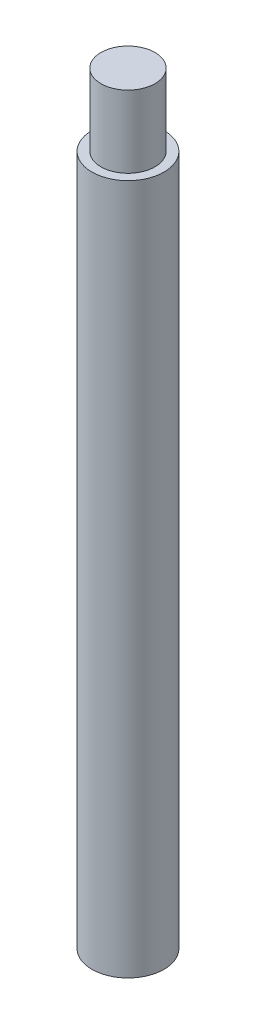
ISO-10303-21;
HEADER;
FILE_DESCRIPTION(('STEP AP214'),'2;1');
FILE_NAME('part.step','',(''),(''),'','','');
FILE_SCHEMA(('AUTOMOTIVE_DESIGN { 1 0 10303 214 1 1 1 1 }'));
ENDSEC;
DATA;
#1=APPLICATION_CONTEXT('core data for automotive mechanical design processes');
#2=APPLICATION_PROTOCOL_DEFINITION('international standard','automotive_design',2000,#1);
#3=PRODUCT_CONTEXT('',#1,'mechanical');
#4=PRODUCT('Part','Part','',(#3));
#5=PRODUCT_RELATED_PRODUCT_CATEGORY('part','',(#4));
#6=PRODUCT_DEFINITION_FORMATION('','',#4);
#7=PRODUCT_DEFINITION_CONTEXT('part definition',#1,'design');
#8=PRODUCT_DEFINITION('design','',#6,#7);
#9=PRODUCT_DEFINITION_SHAPE('','',#8);
#10=(LENGTH_UNIT() NAMED_UNIT(*) SI_UNIT(.MILLI.,.METRE.));
#11=(NAMED_UNIT(*) PLANE_ANGLE_UNIT() SI_UNIT($,.RADIAN.));
#12=(NAMED_UNIT(*) SI_UNIT($,.STERADIAN.) SOLID_ANGLE_UNIT());
#13=UNCERTAINTY_MEASURE_WITH_UNIT(LENGTH_MEASURE(1.E-05),#10,'distance_accuracy_value','');
#14=(GEOMETRIC_REPRESENTATION_CONTEXT(3) GLOBAL_UNCERTAINTY_ASSIGNED_CONTEXT((#13)) GLOBAL_UNIT_ASSIGNED_CONTEXT((#10,
#11,#12)) REPRESENTATION_CONTEXT('',''));
#15=CARTESIAN_POINT('',(0.,0.,0.));
#16=DIRECTION('',(0.,0.,1.));
#17=DIRECTION('',(1.,0.,0.));
#18=AXIS2_PLACEMENT_3D('',#15,#16,#17);
#19=CARTESIAN_POINT('',(0.,57.5,0.));
#20=DIRECTION('',(0.,-1.,0.));
#21=DIRECTION('',(0.,0.,-1.));
#22=AXIS2_PLACEMENT_3D('',#19,#20,#21);
#23=CYLINDRICAL_SURFACE('',#22,3.);
#24=CARTESIAN_POINT('',(0.,57.5,0.));
#25=DIRECTION('',(0.,1.,0.));
#26=DIRECTION('',(0.,0.,1.));
#27=AXIS2_PLACEMENT_3D('',#24,#25,#26);
#28=CIRCLE('',#27,3.);
#29=CARTESIAN_POINT('',(0.,57.5,3.));
#30=VERTEX_POINT('',#29);
#31=EDGE_CURVE('E51',#30,#30,#28,.T.);
#32=ORIENTED_EDGE('',*,*,#31,.F.);
#33=EDGE_LOOP('',(#32));
#34=FACE_BOUND('',#33,.T.);
#35=CARTESIAN_POINT('',(0.,0.,0.));
#36=DIRECTION('',(0.,1.,0.));
#37=DIRECTION('',(0.,0.,1.));
#38=AXIS2_PLACEMENT_3D('',#35,#36,#37);
#39=CIRCLE('',#38,3.);
#40=CARTESIAN_POINT('',(0.,0.,3.));
#41=VERTEX_POINT('',#40);
#42=EDGE_CURVE('E46',#41,#41,#39,.T.);
#43=ORIENTED_EDGE('',*,*,#42,.T.);
#44=EDGE_LOOP('',(#43));
#45=FACE_BOUND('',#44,.T.);
#46=ADVANCED_FACE('F43',(#34,#45),#23,.T.);
#47=CARTESIAN_POINT('',(0.,57.5,0.));
#48=DIRECTION('',(0.,1.,0.));
#49=DIRECTION('',(0.,0.,1.));
#50=AXIS2_PLACEMENT_3D('',#47,#48,#49);
#51=PLANE('',#50);
#52=CARTESIAN_POINT('',(0.,57.5,0.));
#53=DIRECTION('',(0.,1.,0.));
#54=DIRECTION('',(0.,0.,1.));
#55=AXIS2_PLACEMENT_3D('',#52,#53,#54);
#56=CIRCLE('',#55,2.25);
#57=CARTESIAN_POINT('',(0.,57.5,2.25));
#58=VERTEX_POINT('',#57);
#59=EDGE_CURVE('E10',#58,#58,#56,.T.);
#60=ORIENTED_EDGE('',*,*,#59,.F.);
#61=EDGE_LOOP('',(#60));
#62=FACE_BOUND('',#61,.T.);
#63=ORIENTED_EDGE('',*,*,#31,.T.);
#64=EDGE_LOOP('',(#63));
#65=FACE_BOUND('',#64,.T.);
#66=ADVANCED_FACE('F71',(#62,#65),#51,.T.);
#67=CARTESIAN_POINT('',(0.,0.,0.));
#68=DIRECTION('',(0.,1.,0.));
#69=DIRECTION('',(0.,0.,1.));
#70=AXIS2_PLACEMENT_3D('',#67,#68,#69);
#71=PLANE('',#70);
#72=ORIENTED_EDGE('',*,*,#42,.F.);
#73=EDGE_LOOP('',(#72));
#74=FACE_BOUND('',#73,.T.);
#75=ADVANCED_FACE('F68',(#74),#71,.F.);
#76=CARTESIAN_POINT('',(0.,63.5,0.));
#77=DIRECTION('',(0.,-1.,0.));
#78=DIRECTION('',(0.,0.,-1.));
#79=AXIS2_PLACEMENT_3D('',#76,#77,#78);
#80=CYLINDRICAL_SURFACE('',#79,2.25);
#81=CARTESIAN_POINT('',(0.,63.5,0.));
#82=DIRECTION('',(0.,1.,0.));
#83=DIRECTION('',(0.,0.,1.));
#84=AXIS2_PLACEMENT_3D('',#81,#82,#83);
#85=CIRCLE('',#84,2.25);
#86=CARTESIAN_POINT('',(0.,63.5,2.25));
#87=VERTEX_POINT('',#86);
#88=EDGE_CURVE('E58',#87,#87,#85,.T.);
#89=ORIENTED_EDGE('',*,*,#88,.F.);
#90=EDGE_LOOP('',(#89));
#91=FACE_BOUND('',#90,.T.);
#92=ORIENTED_EDGE('',*,*,#59,.T.);
#93=EDGE_LOOP('',(#92));
#94=FACE_BOUND('',#93,.T.);
#95=ADVANCED_FACE('F70',(#91,#94),#80,.T.);
#96=CARTESIAN_POINT('',(0.,63.5,0.));
#97=DIRECTION('',(0.,1.,0.));
#98=DIRECTION('',(0.,0.,1.));
#99=AXIS2_PLACEMENT_3D('',#96,#97,#98);
#100=PLANE('',#99);
#101=ORIENTED_EDGE('',*,*,#88,.T.);
#102=EDGE_LOOP('',(#101));
#103=FACE_BOUND('',#102,.T.);
#104=ADVANCED_FACE('F77',(#103),#100,.T.);
#105=CLOSED_SHELL('',(#46,#66,#75,#95,#104));
#106=MANIFOLD_SOLID_BREP('B2',#105);
#107=ADVANCED_BREP_SHAPE_REPRESENTATION('',(#18,#106),#14);
#108=SHAPE_DEFINITION_REPRESENTATION(#9,#107);
ENDSEC;
END-ISO-10303-21;
